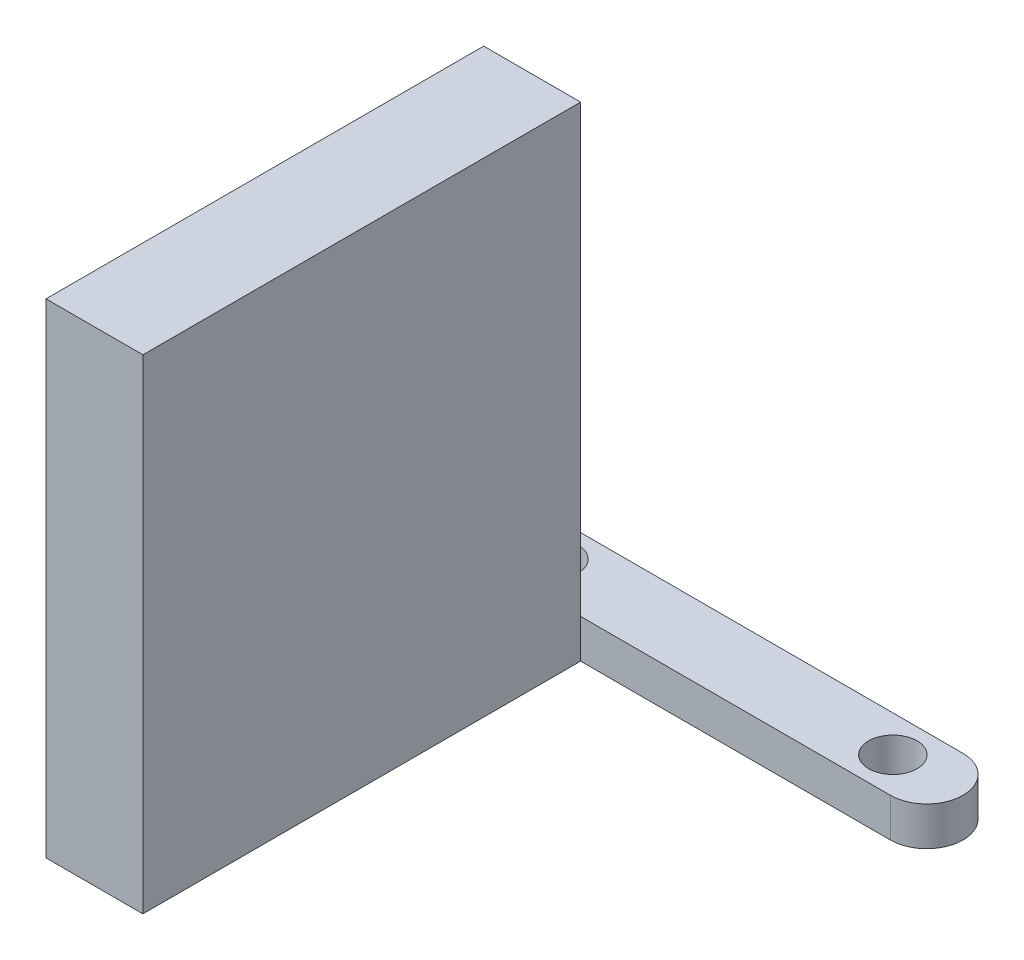
ISO-10303-21;
HEADER;
FILE_DESCRIPTION(('STEP AP214'),'2;1');
FILE_NAME('part.step','',(''),(''),'','','');
FILE_SCHEMA(('AUTOMOTIVE_DESIGN { 1 0 10303 214 1 1 1 1 }'));
ENDSEC;
DATA;
#1=APPLICATION_CONTEXT('core data for automotive mechanical design processes');
#2=APPLICATION_PROTOCOL_DEFINITION('international standard','automotive_design',2000,#1);
#3=PRODUCT_CONTEXT('',#1,'mechanical');
#4=PRODUCT('Part','Part','',(#3));
#5=PRODUCT_RELATED_PRODUCT_CATEGORY('part','',(#4));
#6=PRODUCT_DEFINITION_FORMATION('','',#4);
#7=PRODUCT_DEFINITION_CONTEXT('part definition',#1,'design');
#8=PRODUCT_DEFINITION('design','',#6,#7);
#9=PRODUCT_DEFINITION_SHAPE('','',#8);
#10=(LENGTH_UNIT() NAMED_UNIT(*) SI_UNIT(.MILLI.,.METRE.));
#11=(NAMED_UNIT(*) PLANE_ANGLE_UNIT() SI_UNIT($,.RADIAN.));
#12=(NAMED_UNIT(*) SI_UNIT($,.STERADIAN.) SOLID_ANGLE_UNIT());
#13=UNCERTAINTY_MEASURE_WITH_UNIT(LENGTH_MEASURE(1.E-05),#10,'distance_accuracy_value','');
#14=(GEOMETRIC_REPRESENTATION_CONTEXT(3) GLOBAL_UNCERTAINTY_ASSIGNED_CONTEXT((#13)) GLOBAL_UNIT_ASSIGNED_CONTEXT((#10,
#11,#12)) REPRESENTATION_CONTEXT('',''));
#15=CARTESIAN_POINT('',(0.,0.,0.));
#16=DIRECTION('',(0.,0.,1.));
#17=DIRECTION('',(1.,0.,0.));
#18=AXIS2_PLACEMENT_3D('',#15,#16,#17);
#19=CARTESIAN_POINT('',(-10.4941330554667,1.999996,0.686468646781436));
#20=DIRECTION('',(0.,1.,0.));
#21=DIRECTION('',(0.,0.,1.));
#22=AXIS2_PLACEMENT_3D('',#19,#20,#21);
#23=PLANE('',#22);
#24=CARTESIAN_POINT('',(-8.74412385546675,1.999996,0.686468646781435));
#25=DIRECTION('',(0.,1.,0.));
#26=DIRECTION('',(0.,0.,1.));
#27=AXIS2_PLACEMENT_3D('',#24,#25,#26);
#28=CIRCLE('',#27,1.2499975);
#29=CARTESIAN_POINT('',(-8.74412385546675,1.999996,1.93646614678144));
#30=VERTEX_POINT('',#29);
#31=EDGE_CURVE('E181',#30,#30,#28,.T.);
#32=ORIENTED_EDGE('',*,*,#31,.F.);
#33=EDGE_LOOP('',(#32));
#34=FACE_BOUND('',#33,.T.);
#35=CARTESIAN_POINT('',(-10.4941330554667,1.999996,0.686468646781436));
#36=DIRECTION('',(0.,1.,0.));
#37=DIRECTION('',(0.,0.,1.));
#38=AXIS2_PLACEMENT_3D('',#35,#36,#37);
#39=CIRCLE('',#38,1.8750026);
#40=CARTESIAN_POINT('',(-10.4941330554667,1.999996,-1.18853395321856));
#41=VERTEX_POINT('',#40);
#42=CARTESIAN_POINT('',(-10.4941330554667,1.999996,2.56147124678143));
#43=VERTEX_POINT('',#42);
#44=EDGE_CURVE('E93',#41,#43,#39,.T.);
#45=ORIENTED_EDGE('',*,*,#44,.T.);
#46=DIRECTION('',(1.,0.,0.));
#47=VECTOR('',#46,1.);
#48=CARTESIAN_POINT('',(-10.4941330554667,1.999996,2.56147124678143));
#49=LINE('',#48,#47);
#50=CARTESIAN_POINT('',(-5.49033305546674,1.999996,2.56147124678143));
#51=VERTEX_POINT('',#50);
#52=EDGE_CURVE('E124',#43,#51,#49,.T.);
#53=ORIENTED_EDGE('',*,*,#52,.T.);
#54=CARTESIAN_POINT('',(10.5058757445333,1.999996,2.56147124678143));
#55=VERTEX_POINT('',#54);
#56=EDGE_CURVE('E59',#51,#55,#49,.T.);
#57=ORIENTED_EDGE('',*,*,#56,.T.);
#58=CARTESIAN_POINT('',(10.5058757445333,1.999996,0.686468646781436));
#59=DIRECTION('',(0.,1.,0.));
#60=DIRECTION('',(0.,0.,1.));
#61=AXIS2_PLACEMENT_3D('',#58,#59,#60);
#62=CIRCLE('',#61,1.8750026);
#63=CARTESIAN_POINT('',(10.5058757445333,1.999996,-1.18853395321856));
#64=VERTEX_POINT('',#63);
#65=EDGE_CURVE('E193',#55,#64,#62,.T.);
#66=ORIENTED_EDGE('',*,*,#65,.T.);
#67=DIRECTION('',(-1.,0.,0.));
#68=VECTOR('',#67,1.);
#69=CARTESIAN_POINT('',(-10.4941330554667,1.999996,-1.18853395321856));
#70=LINE('',#69,#68);
#71=EDGE_CURVE('E68',#64,#41,#70,.T.);
#72=ORIENTED_EDGE('',*,*,#71,.T.);
#73=EDGE_LOOP('',(#45,#53,#57,#66,#72));
#74=FACE_BOUND('',#73,.T.);
#75=CARTESIAN_POINT('',(8.75586654453325,1.999996,0.686468646781435));
#76=DIRECTION('',(0.,1.,0.));
#77=DIRECTION('',(0.,0.,-1.));
#78=AXIS2_PLACEMENT_3D('',#75,#76,#77);
#79=CIRCLE('',#78,1.2499975);
#80=CARTESIAN_POINT('',(8.75586654453325,1.999996,-0.563528853218566));
#81=VERTEX_POINT('',#80);
#82=EDGE_CURVE('E173',#81,#81,#79,.T.);
#83=ORIENTED_EDGE('',*,*,#82,.F.);
#84=EDGE_LOOP('',(#83));
#85=FACE_BOUND('',#84,.T.);
#86=ADVANCED_FACE('F44',(#34,#74,#85),#23,.T.);
#87=CARTESIAN_POINT('',(-10.4941330554667,0.,0.686468646781436));
#88=DIRECTION('',(0.,1.,0.));
#89=DIRECTION('',(0.,0.,1.));
#90=AXIS2_PLACEMENT_3D('',#87,#88,#89);
#91=PLANE('',#90);
#92=CARTESIAN_POINT('',(-10.4941330554667,0.,0.686468646781436));
#93=DIRECTION('',(0.,1.,0.));
#94=DIRECTION('',(0.,0.,1.));
#95=AXIS2_PLACEMENT_3D('',#92,#93,#94);
#96=CIRCLE('',#95,1.8750026);
#97=CARTESIAN_POINT('',(-10.4941330554667,0.,-1.18853395321856));
#98=VERTEX_POINT('',#97);
#99=CARTESIAN_POINT('',(-10.4941330554667,0.,2.56147124678143));
#100=VERTEX_POINT('',#99);
#101=EDGE_CURVE('E185',#98,#100,#96,.T.);
#102=ORIENTED_EDGE('',*,*,#101,.F.);
#103=DIRECTION('',(-1.,0.,0.));
#104=VECTOR('',#103,1.);
#105=CARTESIAN_POINT('',(-10.4941330554667,0.,-1.18853395321856));
#106=LINE('',#105,#104);
#107=CARTESIAN_POINT('',(10.5058757445333,0.,-1.18853395321856));
#108=VERTEX_POINT('',#107);
#109=EDGE_CURVE('E89',#108,#98,#106,.T.);
#110=ORIENTED_EDGE('',*,*,#109,.F.);
#111=CARTESIAN_POINT('',(10.5058757445333,0.,0.686468646781436));
#112=DIRECTION('',(0.,1.,0.));
#113=DIRECTION('',(0.,0.,1.));
#114=AXIS2_PLACEMENT_3D('',#111,#112,#113);
#115=CIRCLE('',#114,1.8750026);
#116=CARTESIAN_POINT('',(10.5058757445333,0.,2.56147124678143));
#117=VERTEX_POINT('',#116);
#118=EDGE_CURVE('E204',#117,#108,#115,.T.);
#119=ORIENTED_EDGE('',*,*,#118,.F.);
#120=DIRECTION('',(1.,0.,0.));
#121=VECTOR('',#120,1.);
#122=CARTESIAN_POINT('',(-10.4941330554667,0.,2.56147124678143));
#123=LINE('',#122,#121);
#124=CARTESIAN_POINT('',(-5.49033305546674,0.,2.56147124678143));
#125=VERTEX_POINT('',#124);
#126=EDGE_CURVE('E201',#125,#117,#123,.T.);
#127=ORIENTED_EDGE('',*,*,#126,.F.);
#128=DIRECTION('',(0.,0.,1.));
#129=VECTOR('',#128,1.);
#130=CARTESIAN_POINT('',(-5.49033305546674,0.,2.56147124678143));
#131=LINE('',#130,#129);
#132=CARTESIAN_POINT('',(-5.49033305546674,0.,25.1614768467814));
#133=VERTEX_POINT('',#132);
#134=EDGE_CURVE('E151',#125,#133,#131,.T.);
#135=ORIENTED_EDGE('',*,*,#134,.T.);
#136=DIRECTION('',(-1.,0.,0.));
#137=VECTOR('',#136,1.);
#138=CARTESIAN_POINT('',(-10.4941330554667,0.,25.1614768467814));
#139=LINE('',#138,#137);
#140=CARTESIAN_POINT('',(-10.4941330554667,0.,25.1614768467814));
#141=VERTEX_POINT('',#140);
#142=EDGE_CURVE('E147',#133,#141,#139,.T.);
#143=ORIENTED_EDGE('',*,*,#142,.T.);
#144=DIRECTION('',(0.,0.,-1.));
#145=VECTOR('',#144,1.);
#146=CARTESIAN_POINT('',(-10.4941330554667,0.,2.56147124678143));
#147=LINE('',#146,#145);
#148=EDGE_CURVE('E158',#141,#100,#147,.T.);
#149=ORIENTED_EDGE('',*,*,#148,.T.);
#150=EDGE_LOOP('',(#102,#110,#119,#127,#135,#143,#149));
#151=FACE_BOUND('',#150,.T.);
#152=CARTESIAN_POINT('',(-8.74412385546675,0.,0.686468646781435));
#153=DIRECTION('',(0.,1.,0.));
#154=DIRECTION('',(0.,0.,1.));
#155=AXIS2_PLACEMENT_3D('',#152,#153,#154);
#156=CIRCLE('',#155,1.2499975);
#157=CARTESIAN_POINT('',(-8.74412385546675,0.,1.93646614678144));
#158=VERTEX_POINT('',#157);
#159=EDGE_CURVE('E177',#158,#158,#156,.T.);
#160=ORIENTED_EDGE('',*,*,#159,.T.);
#161=EDGE_LOOP('',(#160));
#162=FACE_BOUND('',#161,.T.);
#163=CARTESIAN_POINT('',(8.75586654453325,0.,0.686468646781435));
#164=DIRECTION('',(0.,1.,0.));
#165=DIRECTION('',(0.,0.,-1.));
#166=AXIS2_PLACEMENT_3D('',#163,#164,#165);
#167=CIRCLE('',#166,1.2499975);
#168=CARTESIAN_POINT('',(8.75586654453325,0.,-0.563528853218566));
#169=VERTEX_POINT('',#168);
#170=EDGE_CURVE('E167',#169,#169,#167,.T.);
#171=ORIENTED_EDGE('',*,*,#170,.T.);
#172=EDGE_LOOP('',(#171));
#173=FACE_BOUND('',#172,.T.);
#174=ADVANCED_FACE('F221',(#151,#162,#173),#91,.F.);
#175=CARTESIAN_POINT('',(-10.4941330554667,1.999996,0.686468646781436));
#176=DIRECTION('',(0.,-1.,0.));
#177=DIRECTION('',(0.,0.,-1.));
#178=AXIS2_PLACEMENT_3D('',#175,#176,#177);
#179=CYLINDRICAL_SURFACE('',#178,1.8750026);
#180=ORIENTED_EDGE('',*,*,#101,.T.);
#181=DIRECTION('',(0.,-1.,0.));
#182=VECTOR('',#181,1.);
#183=CARTESIAN_POINT('',(-10.4941330554667,1.999996,2.56147124678143));
#184=LINE('',#183,#182);
#185=EDGE_CURVE('E53',#43,#100,#184,.T.);
#186=ORIENTED_EDGE('',*,*,#185,.F.);
#187=ORIENTED_EDGE('',*,*,#44,.F.);
#188=DIRECTION('',(0.,-1.,0.));
#189=VECTOR('',#188,1.);
#190=CARTESIAN_POINT('',(-10.4941330554667,1.999996,-1.18853395321856));
#191=LINE('',#190,#189);
#192=EDGE_CURVE('E198',#41,#98,#191,.T.);
#193=ORIENTED_EDGE('',*,*,#192,.T.);
#194=EDGE_LOOP('',(#180,#186,#187,#193));
#195=FACE_BOUND('',#194,.T.);
#196=ADVANCED_FACE('F46',(#195),#179,.T.);
#197=CARTESIAN_POINT('',(-10.4941330554667,1.999996,2.56147124678143));
#198=DIRECTION('',(0.,0.,-1.));
#199=DIRECTION('',(-1.,0.,0.));
#200=AXIS2_PLACEMENT_3D('',#197,#198,#199);
#201=PLANE('',#200);
#202=ORIENTED_EDGE('',*,*,#56,.F.);
#203=DIRECTION('',(0.,-1.,0.));
#204=VECTOR('',#203,1.);
#205=CARTESIAN_POINT('',(-5.49033305546674,1.999996,2.56147124678143));
#206=LINE('',#205,#204);
#207=EDGE_CURVE('E11',#51,#125,#206,.T.);
#208=ORIENTED_EDGE('',*,*,#207,.T.);
#209=ORIENTED_EDGE('',*,*,#126,.T.);
#210=DIRECTION('',(0.,-1.,0.));
#211=VECTOR('',#210,1.);
#212=CARTESIAN_POINT('',(10.5058757445333,1.999996,2.56147124678143));
#213=LINE('',#212,#211);
#214=EDGE_CURVE('E214',#55,#117,#213,.T.);
#215=ORIENTED_EDGE('',*,*,#214,.F.);
#216=EDGE_LOOP('',(#202,#208,#209,#215));
#217=FACE_BOUND('',#216,.T.);
#218=ADVANCED_FACE('F230',(#217),#201,.F.);
#219=CARTESIAN_POINT('',(10.5058757445333,1.999996,0.686468646781436));
#220=DIRECTION('',(0.,-1.,0.));
#221=DIRECTION('',(0.,0.,-1.));
#222=AXIS2_PLACEMENT_3D('',#219,#220,#221);
#223=CYLINDRICAL_SURFACE('',#222,1.8750026);
#224=ORIENTED_EDGE('',*,*,#118,.T.);
#225=DIRECTION('',(0.,-1.,0.));
#226=VECTOR('',#225,1.);
#227=CARTESIAN_POINT('',(10.5058757445333,1.999996,-1.18853395321856));
#228=LINE('',#227,#226);
#229=EDGE_CURVE('E211',#64,#108,#228,.T.);
#230=ORIENTED_EDGE('',*,*,#229,.F.);
#231=ORIENTED_EDGE('',*,*,#65,.F.);
#232=ORIENTED_EDGE('',*,*,#214,.T.);
#233=EDGE_LOOP('',(#224,#230,#231,#232));
#234=FACE_BOUND('',#233,.T.);
#235=ADVANCED_FACE('F234',(#234),#223,.T.);
#236=CARTESIAN_POINT('',(-10.4941330554667,1.999996,-1.18853395321856));
#237=DIRECTION('',(0.,0.,1.));
#238=DIRECTION('',(1.,0.,0.));
#239=AXIS2_PLACEMENT_3D('',#236,#237,#238);
#240=PLANE('',#239);
#241=ORIENTED_EDGE('',*,*,#109,.T.);
#242=ORIENTED_EDGE('',*,*,#192,.F.);
#243=ORIENTED_EDGE('',*,*,#71,.F.);
#244=ORIENTED_EDGE('',*,*,#229,.T.);
#245=EDGE_LOOP('',(#241,#242,#243,#244));
#246=FACE_BOUND('',#245,.T.);
#247=ADVANCED_FACE('F257',(#246),#240,.F.);
#248=CARTESIAN_POINT('',(-8.74412385546675,1.999996,0.686468646781435));
#249=DIRECTION('',(0.,-1.,0.));
#250=DIRECTION('',(0.,0.,-1.));
#251=AXIS2_PLACEMENT_3D('',#248,#249,#250);
#252=CYLINDRICAL_SURFACE('',#251,1.2499975);
#253=ORIENTED_EDGE('',*,*,#31,.T.);
#254=EDGE_LOOP('',(#253));
#255=FACE_BOUND('',#254,.T.);
#256=ORIENTED_EDGE('',*,*,#159,.F.);
#257=EDGE_LOOP('',(#256));
#258=FACE_BOUND('',#257,.T.);
#259=ADVANCED_FACE('F246',(#255,#258),#252,.F.);
#260=CARTESIAN_POINT('',(8.75586654453325,1.999996,0.686468646781435));
#261=DIRECTION('',(0.,-1.,0.));
#262=DIRECTION('',(0.,0.,-1.));
#263=AXIS2_PLACEMENT_3D('',#260,#261,#262);
#264=CYLINDRICAL_SURFACE('',#263,1.2499975);
#265=ORIENTED_EDGE('',*,*,#82,.T.);
#266=EDGE_LOOP('',(#265));
#267=FACE_BOUND('',#266,.T.);
#268=ORIENTED_EDGE('',*,*,#170,.F.);
#269=EDGE_LOOP('',(#268));
#270=FACE_BOUND('',#269,.T.);
#271=ADVANCED_FACE('F243',(#267,#270),#264,.F.);
#272=CARTESIAN_POINT('',(-10.4941330554667,25.0000008,2.56147124678143));
#273=DIRECTION('',(-1.,0.,0.));
#274=DIRECTION('',(0.,0.,1.));
#275=AXIS2_PLACEMENT_3D('',#272,#273,#274);
#276=PLANE('',#275);
#277=ORIENTED_EDGE('',*,*,#148,.F.);
#278=DIRECTION('',(0.,-1.,0.));
#279=VECTOR('',#278,1.);
#280=CARTESIAN_POINT('',(-10.4941330554667,25.0000008,25.1614768467814));
#281=LINE('',#280,#279);
#282=CARTESIAN_POINT('',(-10.4941330554667,25.0000008,25.1614768467814));
#283=VERTEX_POINT('',#282);
#284=EDGE_CURVE('E145',#283,#141,#281,.T.);
#285=ORIENTED_EDGE('',*,*,#284,.F.);
#286=DIRECTION('',(0.,0.,-1.));
#287=VECTOR('',#286,1.);
#288=CARTESIAN_POINT('',(-10.4941330554667,25.0000008,2.56147124678143));
#289=LINE('',#288,#287);
#290=CARTESIAN_POINT('',(-10.4941330554667,25.0000008,2.56147124678143));
#291=VERTEX_POINT('',#290);
#292=EDGE_CURVE('E137',#283,#291,#289,.T.);
#293=ORIENTED_EDGE('',*,*,#292,.T.);
#294=DIRECTION('',(0.,-1.,0.));
#295=VECTOR('',#294,1.);
#296=CARTESIAN_POINT('',(-10.4941330554667,25.0000008,2.56147124678143));
#297=LINE('',#296,#295);
#298=EDGE_CURVE('E119',#291,#43,#297,.T.);
#299=ORIENTED_EDGE('',*,*,#298,.T.);
#300=ORIENTED_EDGE('',*,*,#185,.T.);
#301=EDGE_LOOP('',(#277,#285,#293,#299,#300));
#302=FACE_BOUND('',#301,.T.);
#303=ADVANCED_FACE('F144',(#302),#276,.T.);
#304=CARTESIAN_POINT('',(-10.4941330554667,25.0000008,25.1614768467814));
#305=DIRECTION('',(0.,0.,1.));
#306=DIRECTION('',(1.,0.,0.));
#307=AXIS2_PLACEMENT_3D('',#304,#305,#306);
#308=PLANE('',#307);
#309=ORIENTED_EDGE('',*,*,#142,.F.);
#310=DIRECTION('',(0.,-1.,0.));
#311=VECTOR('',#310,1.);
#312=CARTESIAN_POINT('',(-5.49033305546674,25.0000008,25.1614768467814));
#313=LINE('',#312,#311);
#314=CARTESIAN_POINT('',(-5.49033305546674,25.0000008,25.1614768467814));
#315=VERTEX_POINT('',#314);
#316=EDGE_CURVE('E168',#315,#133,#313,.T.);
#317=ORIENTED_EDGE('',*,*,#316,.F.);
#318=DIRECTION('',(-1.,0.,0.));
#319=VECTOR('',#318,1.);
#320=CARTESIAN_POINT('',(-10.4941330554667,25.0000008,25.1614768467814));
#321=LINE('',#320,#319);
#322=EDGE_CURVE('E130',#315,#283,#321,.T.);
#323=ORIENTED_EDGE('',*,*,#322,.T.);
#324=ORIENTED_EDGE('',*,*,#284,.T.);
#325=EDGE_LOOP('',(#309,#317,#323,#324));
#326=FACE_BOUND('',#325,.T.);
#327=ADVANCED_FACE('F226',(#326),#308,.T.);
#328=CARTESIAN_POINT('',(-5.49033305546674,25.0000008,2.56147124678143));
#329=DIRECTION('',(1.,0.,0.));
#330=DIRECTION('',(0.,0.,-1.));
#331=AXIS2_PLACEMENT_3D('',#328,#329,#330);
#332=PLANE('',#331);
#333=ORIENTED_EDGE('',*,*,#134,.F.);
#334=ORIENTED_EDGE('',*,*,#207,.F.);
#335=DIRECTION('',(0.,-1.,0.));
#336=VECTOR('',#335,1.);
#337=CARTESIAN_POINT('',(-5.49033305546674,25.0000008,2.56147124678143));
#338=LINE('',#337,#336);
#339=CARTESIAN_POINT('',(-5.49033305546674,25.0000008,2.56147124678143));
#340=VERTEX_POINT('',#339);
#341=EDGE_CURVE('E129',#340,#51,#338,.T.);
#342=ORIENTED_EDGE('',*,*,#341,.F.);
#343=DIRECTION('',(0.,0.,1.));
#344=VECTOR('',#343,1.);
#345=CARTESIAN_POINT('',(-5.49033305546674,25.0000008,2.56147124678143));
#346=LINE('',#345,#344);
#347=EDGE_CURVE('E140',#340,#315,#346,.T.);
#348=ORIENTED_EDGE('',*,*,#347,.T.);
#349=ORIENTED_EDGE('',*,*,#316,.T.);
#350=EDGE_LOOP('',(#333,#334,#342,#348,#349));
#351=FACE_BOUND('',#350,.T.);
#352=ADVANCED_FACE('F228',(#351),#332,.T.);
#353=CARTESIAN_POINT('',(-10.4941330554667,25.0000008,2.56147124678143));
#354=DIRECTION('',(0.,0.,-1.));
#355=DIRECTION('',(-1.,0.,0.));
#356=AXIS2_PLACEMENT_3D('',#353,#354,#355);
#357=PLANE('',#356);
#358=ORIENTED_EDGE('',*,*,#341,.T.);
#359=ORIENTED_EDGE('',*,*,#52,.F.);
#360=ORIENTED_EDGE('',*,*,#298,.F.);
#361=DIRECTION('',(1.,0.,0.));
#362=VECTOR('',#361,1.);
#363=CARTESIAN_POINT('',(-10.4941330554667,25.0000008,2.56147124678143));
#364=LINE('',#363,#362);
#365=EDGE_CURVE('E123',#291,#340,#364,.T.);
#366=ORIENTED_EDGE('',*,*,#365,.T.);
#367=EDGE_LOOP('',(#358,#359,#360,#366));
#368=FACE_BOUND('',#367,.T.);
#369=ADVANCED_FACE('F122',(#368),#357,.T.);
#370=CARTESIAN_POINT('',(0.,25.0000008,0.));
#371=DIRECTION('',(0.,1.,0.));
#372=DIRECTION('',(0.,0.,1.));
#373=AXIS2_PLACEMENT_3D('',#370,#371,#372);
#374=PLANE('',#373);
#375=ORIENTED_EDGE('',*,*,#292,.F.);
#376=ORIENTED_EDGE('',*,*,#322,.F.);
#377=ORIENTED_EDGE('',*,*,#347,.F.);
#378=ORIENTED_EDGE('',*,*,#365,.F.);
#379=EDGE_LOOP('',(#375,#376,#377,#378));
#380=FACE_BOUND('',#379,.T.);
#381=ADVANCED_FACE('F135',(#380),#374,.T.);
#382=CLOSED_SHELL('',(#86,#174,#196,#218,#235,#247,#259,#271,#303,#327,#352,#369,#381));
#383=MANIFOLD_SOLID_BREP('B2',#382);
#384=ADVANCED_BREP_SHAPE_REPRESENTATION('',(#18,#383),#14);
#385=SHAPE_DEFINITION_REPRESENTATION(#9,#384);
ENDSEC;
END-ISO-10303-21;
